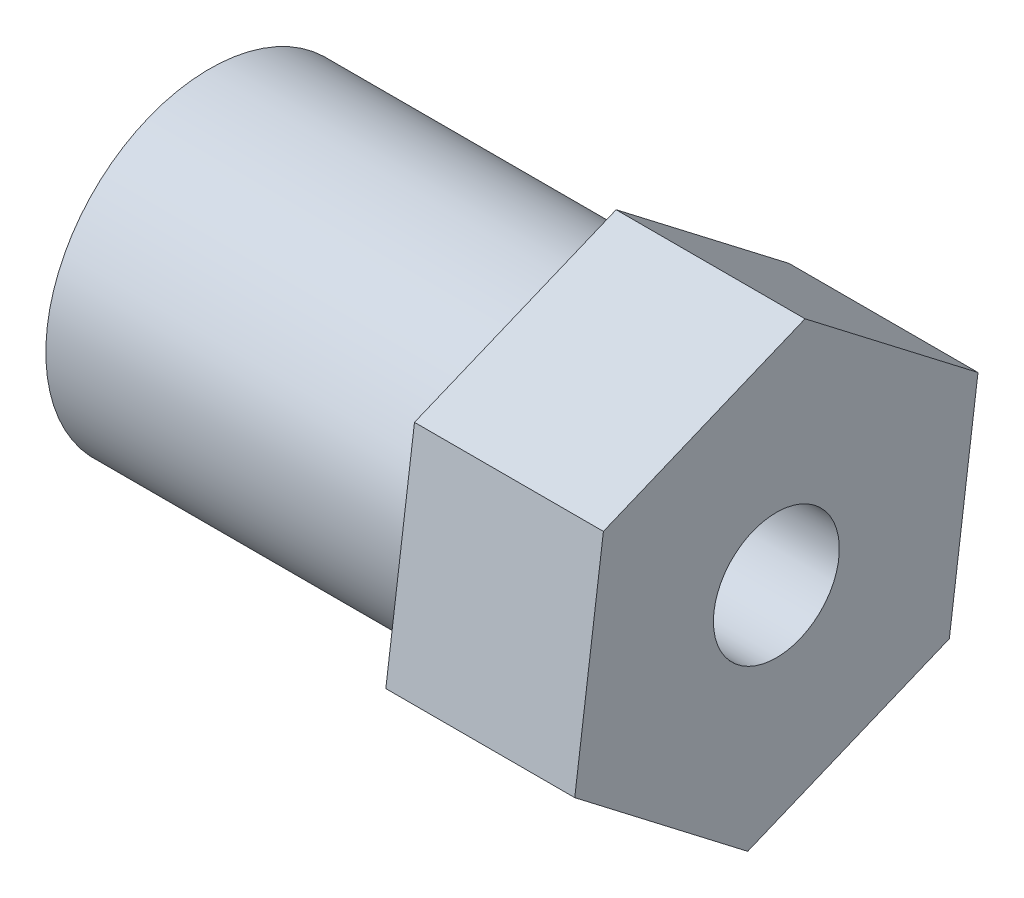
ISO-10303-21;
HEADER;
FILE_DESCRIPTION(('STEP AP214'),'2;1');
FILE_NAME('part.step','',(''),(''),'','','');
FILE_SCHEMA(('AUTOMOTIVE_DESIGN { 1 0 10303 214 1 1 1 1 }'));
ENDSEC;
DATA;
#1=APPLICATION_CONTEXT('core data for automotive mechanical design processes');
#2=APPLICATION_PROTOCOL_DEFINITION('international standard','automotive_design',2000,#1);
#3=PRODUCT_CONTEXT('',#1,'mechanical');
#4=PRODUCT('Part','Part','',(#3));
#5=PRODUCT_RELATED_PRODUCT_CATEGORY('part','',(#4));
#6=PRODUCT_DEFINITION_FORMATION('','',#4);
#7=PRODUCT_DEFINITION_CONTEXT('part definition',#1,'design');
#8=PRODUCT_DEFINITION('design','',#6,#7);
#9=PRODUCT_DEFINITION_SHAPE('','',#8);
#10=(LENGTH_UNIT() NAMED_UNIT(*) SI_UNIT(.MILLI.,.METRE.));
#11=(NAMED_UNIT(*) PLANE_ANGLE_UNIT() SI_UNIT($,.RADIAN.));
#12=(NAMED_UNIT(*) SI_UNIT($,.STERADIAN.) SOLID_ANGLE_UNIT());
#13=UNCERTAINTY_MEASURE_WITH_UNIT(LENGTH_MEASURE(1.E-05),#10,'distance_accuracy_value','');
#14=(GEOMETRIC_REPRESENTATION_CONTEXT(3) GLOBAL_UNCERTAINTY_ASSIGNED_CONTEXT((#13)) GLOBAL_UNIT_ASSIGNED_CONTEXT((#10,
#11,#12)) REPRESENTATION_CONTEXT('',''));
#15=CARTESIAN_POINT('',(0.,0.,0.));
#16=DIRECTION('',(0.,0.,1.));
#17=DIRECTION('',(1.,0.,0.));
#18=AXIS2_PLACEMENT_3D('',#15,#16,#17);
#19=CARTESIAN_POINT('',(82.,204.222582714816,-28.0072961834326));
#20=DIRECTION('',(0.,0.131421085967779,0.991326635455262));
#21=DIRECTION('',(0.,-0.991326635455262,0.131421085967779));
#22=AXIS2_PLACEMENT_3D('',#19,#20,#21);
#23=PLANE('',#22);
#24=DIRECTION('',(0.,-0.991326635455262,0.131421085967779));
#25=VECTOR('',#24,1.);
#26=CARTESIAN_POINT('',(88.,204.222582714816,-28.0072961834326));
#27=LINE('',#26,#25);
#28=CARTESIAN_POINT('',(88.,204.222582714816,-28.0072961834326));
#29=VERTEX_POINT('',#28);
#30=CARTESIAN_POINT('',(88.,197.354470316797,-27.0967841911043));
#31=VERTEX_POINT('',#30);
#32=EDGE_CURVE('E122',#29,#31,#27,.T.);
#33=ORIENTED_EDGE('',*,*,#32,.F.);
#34=DIRECTION('',(1.,0.,0.));
#35=VECTOR('',#34,1.);
#36=CARTESIAN_POINT('',(82.,204.222582714816,-28.0072961834326));
#37=LINE('',#36,#35);
#38=CARTESIAN_POINT('',(82.,204.222582714816,-28.0072961834326));
#39=VERTEX_POINT('',#38);
#40=EDGE_CURVE('E11',#39,#29,#37,.T.);
#41=ORIENTED_EDGE('',*,*,#40,.F.);
#42=DIRECTION('',(0.,-0.991326635455262,0.131421085967779));
#43=VECTOR('',#42,1.);
#44=CARTESIAN_POINT('',(82.,204.222582714816,-28.0072961834326));
#45=LINE('',#44,#43);
#46=CARTESIAN_POINT('',(82.,197.354470316797,-27.0967841911043));
#47=VERTEX_POINT('',#46);
#48=EDGE_CURVE('E137',#39,#47,#45,.T.);
#49=ORIENTED_EDGE('',*,*,#48,.T.);
#50=DIRECTION('',(1.,0.,0.));
#51=VECTOR('',#50,1.);
#52=CARTESIAN_POINT('',(82.,197.354470316797,-27.0967841911043));
#53=LINE('',#52,#51);
#54=EDGE_CURVE('E86',#47,#31,#53,.T.);
#55=ORIENTED_EDGE('',*,*,#54,.T.);
#56=EDGE_LOOP('',(#33,#41,#49,#55));
#57=FACE_BOUND('',#56,.T.);
#58=ADVANCED_FACE('F32',(#57),#23,.T.);
#59=CARTESIAN_POINT('',(82.,206.868112398019,-34.4105119923284));
#60=DIRECTION('',(0.,0.924224592736304,0.38184931868659));
#61=DIRECTION('',(0.,-0.38184931868659,0.924224592736304));
#62=AXIS2_PLACEMENT_3D('',#59,#60,#61);
#63=PLANE('',#62);
#64=DIRECTION('',(0.,-0.38184931868659,0.924224592736304));
#65=VECTOR('',#64,1.);
#66=CARTESIAN_POINT('',(88.,206.868112398019,-34.4105119923284));
#67=LINE('',#66,#65);
#68=CARTESIAN_POINT('',(88.,206.868112398019,-34.4105119923284));
#69=VERTEX_POINT('',#68);
#70=EDGE_CURVE('E135',#69,#29,#67,.T.);
#71=ORIENTED_EDGE('',*,*,#70,.F.);
#72=DIRECTION('',(1.,0.,0.));
#73=VECTOR('',#72,1.);
#74=CARTESIAN_POINT('',(82.,206.868112398019,-34.4105119923284));
#75=LINE('',#74,#73);
#76=CARTESIAN_POINT('',(82.,206.868112398019,-34.4105119923284));
#77=VERTEX_POINT('',#76);
#78=EDGE_CURVE('E45',#77,#69,#75,.T.);
#79=ORIENTED_EDGE('',*,*,#78,.F.);
#80=DIRECTION('',(0.,-0.38184931868659,0.924224592736304));
#81=VECTOR('',#80,1.);
#82=CARTESIAN_POINT('',(82.,206.868112398019,-34.4105119923284));
#83=LINE('',#82,#81);
#84=EDGE_CURVE('E112',#77,#39,#83,.T.);
#85=ORIENTED_EDGE('',*,*,#84,.T.);
#86=ORIENTED_EDGE('',*,*,#40,.T.);
#87=EDGE_LOOP('',(#71,#79,#85,#86));
#88=FACE_BOUND('',#87,.T.);
#89=ADVANCED_FACE('F146',(#88),#63,.T.);
#90=CARTESIAN_POINT('',(82.,202.645529683203,-39.9032158088957));
#91=DIRECTION('',(0.,0.792803506768531,-0.609477316768655));
#92=DIRECTION('',(0.,0.609477316768655,0.792803506768531));
#93=AXIS2_PLACEMENT_3D('',#90,#91,#92);
#94=PLANE('',#93);
#95=DIRECTION('',(0.,0.609477316768655,0.792803506768531));
#96=VECTOR('',#95,1.);
#97=CARTESIAN_POINT('',(88.,202.645529683203,-39.9032158088957));
#98=LINE('',#97,#96);
#99=CARTESIAN_POINT('',(88.,202.645529683203,-39.9032158088957));
#100=VERTEX_POINT('',#99);
#101=EDGE_CURVE('E99',#100,#69,#98,.T.);
#102=ORIENTED_EDGE('',*,*,#101,.F.);
#103=DIRECTION('',(1.,0.,0.));
#104=VECTOR('',#103,1.);
#105=CARTESIAN_POINT('',(82.,202.645529683203,-39.9032158088957));
#106=LINE('',#105,#104);
#107=CARTESIAN_POINT('',(82.,202.645529683203,-39.9032158088957));
#108=VERTEX_POINT('',#107);
#109=EDGE_CURVE('E94',#108,#100,#106,.T.);
#110=ORIENTED_EDGE('',*,*,#109,.F.);
#111=DIRECTION('',(0.,0.609477316768655,0.792803506768531));
#112=VECTOR('',#111,1.);
#113=CARTESIAN_POINT('',(82.,202.645529683203,-39.9032158088957));
#114=LINE('',#113,#112);
#115=EDGE_CURVE('E97',#108,#77,#114,.T.);
#116=ORIENTED_EDGE('',*,*,#115,.T.);
#117=ORIENTED_EDGE('',*,*,#78,.T.);
#118=EDGE_LOOP('',(#102,#110,#116,#117));
#119=FACE_BOUND('',#118,.T.);
#120=ADVANCED_FACE('F96',(#119),#94,.T.);
#121=CARTESIAN_POINT('',(82.,195.777417285184,-38.9927038165675));
#122=DIRECTION('',(0.,-0.131421085967778,-0.991326635455262));
#123=DIRECTION('',(0.,0.991326635455262,-0.131421085967778));
#124=AXIS2_PLACEMENT_3D('',#121,#122,#123);
#125=PLANE('',#124);
#126=DIRECTION('',(0.,0.991326635455262,-0.131421085967778));
#127=VECTOR('',#126,1.);
#128=CARTESIAN_POINT('',(88.,195.777417285184,-38.9927038165675));
#129=LINE('',#128,#127);
#130=CARTESIAN_POINT('',(88.,195.777417285184,-38.9927038165675));
#131=VERTEX_POINT('',#130);
#132=EDGE_CURVE('E132',#131,#100,#129,.T.);
#133=ORIENTED_EDGE('',*,*,#132,.F.);
#134=DIRECTION('',(1.,0.,0.));
#135=VECTOR('',#134,1.);
#136=CARTESIAN_POINT('',(82.,195.777417285184,-38.9927038165675));
#137=LINE('',#136,#135);
#138=CARTESIAN_POINT('',(82.,195.777417285184,-38.9927038165675));
#139=VERTEX_POINT('',#138);
#140=EDGE_CURVE('E104',#139,#131,#137,.T.);
#141=ORIENTED_EDGE('',*,*,#140,.F.);
#142=DIRECTION('',(0.,0.991326635455262,-0.131421085967778));
#143=VECTOR('',#142,1.);
#144=CARTESIAN_POINT('',(82.,195.777417285184,-38.9927038165675));
#145=LINE('',#144,#143);
#146=EDGE_CURVE('E110',#139,#108,#145,.T.);
#147=ORIENTED_EDGE('',*,*,#146,.T.);
#148=ORIENTED_EDGE('',*,*,#109,.T.);
#149=EDGE_LOOP('',(#133,#141,#147,#148));
#150=FACE_BOUND('',#149,.T.);
#151=ADVANCED_FACE('F114',(#150),#125,.T.);
#152=CARTESIAN_POINT('',(82.,193.131887601981,-32.5894880076718));
#153=DIRECTION('',(0.,-0.924224592736302,-0.381849318686595));
#154=DIRECTION('',(0.,0.381849318686595,-0.924224592736302));
#155=AXIS2_PLACEMENT_3D('',#152,#153,#154);
#156=PLANE('',#155);
#157=DIRECTION('',(0.,0.381849318686595,-0.924224592736302));
#158=VECTOR('',#157,1.);
#159=CARTESIAN_POINT('',(88.,193.131887601981,-32.5894880076718));
#160=LINE('',#159,#158);
#161=CARTESIAN_POINT('',(88.,193.131887601981,-32.5894880076718));
#162=VERTEX_POINT('',#161);
#163=EDGE_CURVE('E129',#162,#131,#160,.T.);
#164=ORIENTED_EDGE('',*,*,#163,.F.);
#165=DIRECTION('',(1.,0.,0.));
#166=VECTOR('',#165,1.);
#167=CARTESIAN_POINT('',(82.,193.131887601981,-32.5894880076718));
#168=LINE('',#167,#166);
#169=CARTESIAN_POINT('',(82.,193.131887601981,-32.5894880076718));
#170=VERTEX_POINT('',#169);
#171=EDGE_CURVE('E141',#170,#162,#168,.T.);
#172=ORIENTED_EDGE('',*,*,#171,.F.);
#173=DIRECTION('',(0.,0.381849318686595,-0.924224592736302));
#174=VECTOR('',#173,1.);
#175=CARTESIAN_POINT('',(82.,193.131887601981,-32.5894880076718));
#176=LINE('',#175,#174);
#177=EDGE_CURVE('E115',#170,#139,#176,.T.);
#178=ORIENTED_EDGE('',*,*,#177,.T.);
#179=ORIENTED_EDGE('',*,*,#140,.T.);
#180=EDGE_LOOP('',(#164,#172,#178,#179));
#181=FACE_BOUND('',#180,.T.);
#182=ADVANCED_FACE('F159',(#181),#156,.T.);
#183=CARTESIAN_POINT('',(82.,197.354470316797,-27.0967841911043));
#184=DIRECTION('',(0.,-0.792803506768541,0.609477316768642));
#185=DIRECTION('',(0.,-0.609477316768642,-0.792803506768541));
#186=AXIS2_PLACEMENT_3D('',#183,#184,#185);
#187=PLANE('',#186);
#188=DIRECTION('',(0.,-0.609477316768642,-0.792803506768541));
#189=VECTOR('',#188,1.);
#190=CARTESIAN_POINT('',(88.,197.354470316797,-27.0967841911043));
#191=LINE('',#190,#189);
#192=EDGE_CURVE('E125',#31,#162,#191,.T.);
#193=ORIENTED_EDGE('',*,*,#192,.F.);
#194=ORIENTED_EDGE('',*,*,#54,.F.);
#195=DIRECTION('',(0.,-0.609477316768642,-0.792803506768541));
#196=VECTOR('',#195,1.);
#197=CARTESIAN_POINT('',(82.,197.354470316797,-27.0967841911043));
#198=LINE('',#197,#196);
#199=EDGE_CURVE('E117',#47,#170,#198,.T.);
#200=ORIENTED_EDGE('',*,*,#199,.T.);
#201=ORIENTED_EDGE('',*,*,#171,.T.);
#202=EDGE_LOOP('',(#193,#194,#200,#201));
#203=FACE_BOUND('',#202,.T.);
#204=ADVANCED_FACE('F142',(#203),#187,.T.);
#205=CARTESIAN_POINT('',(82.,0.,0.));
#206=DIRECTION('',(1.,0.,0.));
#207=DIRECTION('',(0.,0.,-1.));
#208=AXIS2_PLACEMENT_3D('',#205,#206,#207);
#209=PLANE('',#208);
#210=CARTESIAN_POINT('',(82.,200.,-33.5000000000001));
#211=DIRECTION('',(1.,0.,0.));
#212=DIRECTION('',(0.,0.,-1.));
#213=AXIS2_PLACEMENT_3D('',#210,#211,#212);
#214=CIRCLE('',#213,5.20000000000001);
#215=CARTESIAN_POINT('',(82.,200.,-38.7000000000001));
#216=VERTEX_POINT('',#215);
#217=EDGE_CURVE('E217',#216,#216,#214,.T.);
#218=ORIENTED_EDGE('',*,*,#217,.T.);
#219=EDGE_LOOP('',(#218));
#220=FACE_BOUND('',#219,.T.);
#221=ORIENTED_EDGE('',*,*,#48,.F.);
#222=ORIENTED_EDGE('',*,*,#84,.F.);
#223=ORIENTED_EDGE('',*,*,#115,.F.);
#224=ORIENTED_EDGE('',*,*,#146,.F.);
#225=ORIENTED_EDGE('',*,*,#177,.F.);
#226=ORIENTED_EDGE('',*,*,#199,.F.);
#227=EDGE_LOOP('',(#221,#222,#223,#224,#225,#226));
#228=FACE_BOUND('',#227,.T.);
#229=ADVANCED_FACE('F108',(#220,#228),#209,.F.);
#230=CARTESIAN_POINT('',(88.,0.,0.));
#231=DIRECTION('',(1.,0.,0.));
#232=DIRECTION('',(0.,0.,-1.));
#233=AXIS2_PLACEMENT_3D('',#230,#231,#232);
#234=PLANE('',#233);
#235=CARTESIAN_POINT('',(88.,200.,-33.5000000000001));
#236=DIRECTION('',(-1.,0.,0.));
#237=DIRECTION('',(0.,0.,1.));
#238=AXIS2_PLACEMENT_3D('',#235,#236,#237);
#239=CIRCLE('',#238,2.);
#240=CARTESIAN_POINT('',(88.,200.,-31.5000000000001));
#241=VERTEX_POINT('',#240);
#242=EDGE_CURVE('E211',#241,#241,#239,.T.);
#243=ORIENTED_EDGE('',*,*,#242,.T.);
#244=EDGE_LOOP('',(#243));
#245=FACE_BOUND('',#244,.T.);
#246=ORIENTED_EDGE('',*,*,#32,.T.);
#247=ORIENTED_EDGE('',*,*,#192,.T.);
#248=ORIENTED_EDGE('',*,*,#163,.T.);
#249=ORIENTED_EDGE('',*,*,#132,.T.);
#250=ORIENTED_EDGE('',*,*,#101,.T.);
#251=ORIENTED_EDGE('',*,*,#70,.T.);
#252=EDGE_LOOP('',(#246,#247,#248,#249,#250,#251));
#253=FACE_BOUND('',#252,.T.);
#254=ADVANCED_FACE('F145',(#245,#253),#234,.T.);
#255=CARTESIAN_POINT('',(70.,200.,-33.5000000000001));
#256=DIRECTION('',(1.,0.,0.));
#257=DIRECTION('',(0.,0.,-1.));
#258=AXIS2_PLACEMENT_3D('',#255,#256,#257);
#259=CYLINDRICAL_SURFACE('',#258,5.20000000000001);
#260=CARTESIAN_POINT('',(74.,194.843394423274,-34.1703871464174));
#261=CARTESIAN_POINT('',(73.9172151989861,194.843393978066,-34.1703888603776));
#262=CARTESIAN_POINT('',(73.8344160251718,194.844298121491,-34.1774531707076));
#263=CARTESIAN_POINT('',(73.6712142410844,194.848048736445,-34.20540137638));
#264=CARTESIAN_POINT('',(73.5908125545988,194.850895946824,-34.2262905285315));
#265=CARTESIAN_POINT('',(73.4347772141554,194.858906041283,-34.2809668792829));
#266=CARTESIAN_POINT('',(73.3591373856836,194.864065853102,-34.3147369569112));
#267=CARTESIAN_POINT('',(73.2144743297482,194.877249095533,-34.3938826663532));
#268=CARTESIAN_POINT('',(73.1454517915219,194.885272824032,-34.439259505291));
#269=CARTESIAN_POINT('',(73.0143270754073,194.905028170433,-34.5411564021015));
#270=CARTESIAN_POINT('',(72.9524080380351,194.916836629289,-34.5978973318329));
#271=CARTESIAN_POINT('',(72.8388832656474,194.944753001841,-34.7199972284268));
#272=CARTESIAN_POINT('',(72.7872782954408,194.960861234168,-34.7853568337855));
#273=CARTESIAN_POINT('',(72.6952844079851,194.998099401605,-34.9234305306471));
#274=CARTESIAN_POINT('',(72.6550333594924,195.019285727295,-34.9962215239997));
#275=CARTESIAN_POINT('',(72.587832584414,195.066805126155,-35.1461351458379));
#276=CARTESIAN_POINT('',(72.5608800437391,195.093137108808,-35.2232568540532));
#277=CARTESIAN_POINT('',(72.5217298919954,195.149961624158,-35.3771435349726));
#278=CARTESIAN_POINT('',(72.5091471215833,195.180319920435,-35.4538600585044));
#279=CARTESIAN_POINT('',(72.4978217852048,195.245092207103,-35.6065915264637));
#280=CARTESIAN_POINT('',(72.49907709674,195.279505574722,-35.6826065766938));
#281=CARTESIAN_POINT('',(72.5151258775454,195.350487593366,-35.8299287915649));
#282=CARTESIAN_POINT('',(72.5296011001577,195.386986755001,-35.9013045625287));
#283=CARTESIAN_POINT('',(72.5711073844156,195.461556151297,-36.0394274746923));
#284=CARTESIAN_POINT('',(72.5981396509638,195.499626536405,-36.1061741710058));
#285=CARTESIAN_POINT('',(72.6645058214607,195.576544793148,-36.2347324814715));
#286=CARTESIAN_POINT('',(72.7040557345057,195.615394146555,-36.2964314686664));
#287=CARTESIAN_POINT('',(72.7941667895674,195.691497847416,-36.4123226160529));
#288=CARTESIAN_POINT('',(72.8447306993233,195.728751791135,-36.4665128837461));
#289=CARTESIAN_POINT('',(72.9577458242448,195.801303431706,-36.5683890530553));
#290=CARTESIAN_POINT('',(73.0205799479713,195.836470475263,-36.6157439516502));
#291=CARTESIAN_POINT('',(73.1551824754775,195.901278621654,-36.7005215601845));
#292=CARTESIAN_POINT('',(73.2269514704255,195.93091935852,-36.737943612412));
#293=CARTESIAN_POINT('',(73.3778628215966,195.982929515278,-36.8022521066046));
#294=CARTESIAN_POINT('',(73.4570306783118,196.005272498135,-36.8291003141734));
#295=CARTESIAN_POINT('',(73.6202755873242,196.040945476245,-36.8714482836556));
#296=CARTESIAN_POINT('',(73.7043507688421,196.054278882079,-36.8869523400885));
#297=CARTESIAN_POINT('',(73.8710860218403,196.070535307674,-36.905797376701));
#298=CARTESIAN_POINT('',(73.9536478267788,196.073887095533,-36.9096394534047));
#299=CARTESIAN_POINT('',(74.118399008938,196.071150488445,-36.9064859447009));
#300=CARTESIAN_POINT('',(74.2005884385341,196.065063465213,-36.8994919340727));
#301=CARTESIAN_POINT('',(74.3599370560577,196.04420141504,-36.8751888603725));
#302=CARTESIAN_POINT('',(74.4371723147333,196.029668109034,-36.8581666129784));
#303=CARTESIAN_POINT('',(74.5869661730415,195.993078214786,-36.8144208755424));
#304=CARTESIAN_POINT('',(74.659524016439,195.971020413608,-36.7876958213797));
#305=CARTESIAN_POINT('',(74.8003140667745,195.919945440837,-36.7241062575734));
#306=CARTESIAN_POINT('',(74.8683504099315,195.890738826024,-36.6869608380765));
#307=CARTESIAN_POINT('',(74.9960282912814,195.827389103074,-36.6035554363839));
#308=CARTESIAN_POINT('',(75.0556676244413,195.79324470304,-36.5572930677257));
#309=CARTESIAN_POINT('',(75.1675168772009,195.720192970084,-36.4542180850339));
#310=CARTESIAN_POINT('',(75.2192947707026,195.681143632664,-36.3970361547505));
#311=CARTESIAN_POINT('',(75.310757616177,195.60150303473,-36.2746259363155));
#312=CARTESIAN_POINT('',(75.3504426624268,195.560911786241,-36.2093977108994));
#313=CARTESIAN_POINT('',(75.4163804491606,195.480193745446,-36.0724779022995));
#314=CARTESIAN_POINT('',(75.4426704486871,195.440065971621,-36.0008049070845));
#315=CARTESIAN_POINT('',(75.4810146488863,195.361904144143,-35.8526728414292));
#316=CARTESIAN_POINT('',(75.4930729057416,195.323869496877,-35.7762151412207));
#317=CARTESIAN_POINT('',(75.5022677328863,195.252743589415,-35.6237609582594));
#318=CARTESIAN_POINT('',(75.4999615192239,195.21951829871,-35.547860282601));
#319=CARTESIAN_POINT('',(75.4817542948019,195.157271264159,-35.3959729901264));
#320=CARTESIAN_POINT('',(75.4658545064532,195.128249142616,-35.3199863816514));
#321=CARTESIAN_POINT('',(75.4213463160934,195.075350427721,-35.1715090116961));
#322=CARTESIAN_POINT('',(75.3929514849842,195.051396976855,-35.0989812897863));
#323=CARTESIAN_POINT('',(75.3243715610934,195.008114373842,-34.9582536400124));
#324=CARTESIAN_POINT('',(75.2841849777102,194.988785806889,-34.8900542606229));
#325=CARTESIAN_POINT('',(75.1920095253379,194.954084483143,-34.7583688591094));
#326=CARTESIAN_POINT('',(75.1397532262464,194.938821442735,-34.6950412197738));
#327=CARTESIAN_POINT('',(75.0254135175609,194.912386360501,-34.5769660317682));
#328=CARTESIAN_POINT('',(74.9633275352998,194.901215392214,-34.5222207367925));
#329=CARTESIAN_POINT('',(74.8290833076645,194.882080611344,-34.4217344289372));
#330=CARTESIAN_POINT('',(74.7566962389085,194.874212749805,-34.3762802542842));
#331=CARTESIAN_POINT('',(74.605157087981,194.861446262608,-34.2980267974329));
#332=CARTESIAN_POINT('',(74.5260082535178,194.856546220539,-34.2652214812085));
#333=CARTESIAN_POINT('',(74.3728706788545,194.849572842622,-34.216677673642));
#334=CARTESIAN_POINT('',(74.2993870394306,194.847232721758,-34.1993739212099));
#335=CARTESIAN_POINT('',(74.1506060667912,194.844143822289,-34.1762286537719));
#336=CARTESIAN_POINT('',(74.0753089804747,194.843394828279,-34.1703855872352));
#337=CARTESIAN_POINT('',(74.,194.843394423274,-34.1703871464174));
#338=B_SPLINE_CURVE_WITH_KNOTS('',3,(#260,#261,#262,#263,#264,#265,#266,#267,#268,#269,#270,
#271,#272,#273,#274,#275,#276,#277,#278,#279,#280,#281,#282,#283,#284,#285,#286,#287,#288,#289,
#290,#291,#292,#293,#294,#295,#296,#297,#298,#299,#300,#301,#302,#303,#304,#305,#306,#307,#308,
#309,#310,#311,#312,#313,#314,#315,#316,#317,#318,#319,#320,#321,#322,#323,#324,#325,#326,#327,
#328,#329,#330,#331,#332,#333,#334,#335,#336,#337),.UNSPECIFIED.,.T.,.F.,(4,2,2,2,2,2,2,2,2,2,2,
2,2,2,2,2,2,2,2,2,2,2,2,2,2,2,2,2,2,2,2,2,2,2,2,2,2,2,4),(0.,0.248078580290188,
0.496251545139838,0.744095788357517,0.991965818312516,1.24522628959864,1.49850553369757,
1.7547395146081,2.01091925072391,2.26005825866556,2.50915905395316,2.75241684979214,
2.99569799209189,3.24342993126932,3.49122419569248,3.74856460522973,4.00592205053566,
4.26420172392208,4.52238357052391,4.76930250341406,5.01618555560962,5.2563286501694,
5.49651047370173,5.74391967006568,5.99139371475406,6.24955419513769,6.50771266282331,
6.76514907401896,7.02251209564666,7.26995552317413,7.51737670153151,7.7607238432678,
8.00410175990412,8.25350180005201,8.50296722249372,8.75924763090075,9.01540563129902,
9.24111221587513,9.46678824251845),.UNSPECIFIED.);
#339=CARTESIAN_POINT('',(74.,194.843394423274,-34.1703871464174));
#340=VERTEX_POINT('',#339);
#341=EDGE_CURVE('E181',#340,#340,#338,.T.);
#342=ORIENTED_EDGE('',*,*,#341,.F.);
#343=EDGE_LOOP('',(#342));
#344=FACE_BOUND('',#343,.T.);
#345=CARTESIAN_POINT('',(70.,200.,-33.5000000000001));
#346=DIRECTION('',(1.,0.,0.));
#347=DIRECTION('',(0.,0.,-1.));
#348=AXIS2_PLACEMENT_3D('',#345,#346,#347);
#349=CIRCLE('',#348,5.20000000000001);
#350=CARTESIAN_POINT('',(70.,200.,-38.7000000000001));
#351=VERTEX_POINT('',#350);
#352=EDGE_CURVE('E126',#351,#351,#349,.T.);
#353=ORIENTED_EDGE('',*,*,#352,.T.);
#354=EDGE_LOOP('',(#353));
#355=FACE_BOUND('',#354,.T.);
#356=ORIENTED_EDGE('',*,*,#217,.F.);
#357=EDGE_LOOP('',(#356));
#358=FACE_BOUND('',#357,.T.);
#359=ADVANCED_FACE('F170',(#344,#355,#358),#259,.T.);
#360=CARTESIAN_POINT('',(70.,205.2,-33.5000000000001));
#361=DIRECTION('',(-1.,0.,0.));
#362=DIRECTION('',(0.,0.,1.));
#363=AXIS2_PLACEMENT_3D('',#360,#361,#362);
#364=PLANE('',#363);
#365=CARTESIAN_POINT('',(70.,200.,-33.5000000000001));
#366=DIRECTION('',(-1.,0.,0.));
#367=DIRECTION('',(0.,0.,1.));
#368=AXIS2_PLACEMENT_3D('',#365,#366,#367);
#369=CIRCLE('',#368,2.5);
#370=CARTESIAN_POINT('',(70.,200.,-31.0000000000001));
#371=VERTEX_POINT('',#370);
#372=EDGE_CURVE('E186',#371,#371,#369,.T.);
#373=ORIENTED_EDGE('',*,*,#372,.F.);
#374=EDGE_LOOP('',(#373));
#375=FACE_BOUND('',#374,.T.);
#376=ORIENTED_EDGE('',*,*,#352,.F.);
#377=EDGE_LOOP('',(#376));
#378=FACE_BOUND('',#377,.T.);
#379=ADVANCED_FACE('F177',(#375,#378),#364,.T.);
#380=CARTESIAN_POINT('',(70.,200.,-33.5000000000001));
#381=DIRECTION('',(-1.,0.,0.));
#382=DIRECTION('',(0.,0.,1.));
#383=AXIS2_PLACEMENT_3D('',#380,#381,#382);
#384=CYLINDRICAL_SURFACE('',#383,2.);
#385=ORIENTED_EDGE('',*,*,#242,.F.);
#386=EDGE_LOOP('',(#385));
#387=FACE_BOUND('',#386,.T.);
#388=CARTESIAN_POINT('',(82.,200.,-33.5000000000001));
#389=DIRECTION('',(-1.,0.,0.));
#390=DIRECTION('',(0.,0.,1.));
#391=AXIS2_PLACEMENT_3D('',#388,#389,#390);
#392=CIRCLE('',#391,2.);
#393=CARTESIAN_POINT('',(82.,200.,-31.5000000000001));
#394=VERTEX_POINT('',#393);
#395=EDGE_CURVE('E214',#394,#394,#392,.T.);
#396=ORIENTED_EDGE('',*,*,#395,.T.);
#397=EDGE_LOOP('',(#396));
#398=FACE_BOUND('',#397,.T.);
#399=ADVANCED_FACE('F200',(#387,#398),#384,.F.);
#400=CARTESIAN_POINT('',(82.,202.,-33.5000000000001));
#401=DIRECTION('',(1.,0.,0.));
#402=DIRECTION('',(0.,0.,-1.));
#403=AXIS2_PLACEMENT_3D('',#400,#401,#402);
#404=PLANE('',#403);
#405=ORIENTED_EDGE('',*,*,#395,.F.);
#406=EDGE_LOOP('',(#405));
#407=FACE_BOUND('',#406,.T.);
#408=CARTESIAN_POINT('',(82.,200.,-33.5000000000001));
#409=DIRECTION('',(-1.,0.,0.));
#410=DIRECTION('',(0.,0.,1.));
#411=AXIS2_PLACEMENT_3D('',#408,#409,#410);
#412=CIRCLE('',#411,2.5);
#413=CARTESIAN_POINT('',(82.,200.,-31.0000000000001));
#414=VERTEX_POINT('',#413);
#415=EDGE_CURVE('E215',#414,#414,#412,.T.);
#416=ORIENTED_EDGE('',*,*,#415,.T.);
#417=EDGE_LOOP('',(#416));
#418=FACE_BOUND('',#417,.T.);
#419=ADVANCED_FACE('F197',(#407,#418),#404,.F.);
#420=CARTESIAN_POINT('',(70.,200.,-33.5000000000001));
#421=DIRECTION('',(-1.,0.,0.));
#422=DIRECTION('',(0.,0.,1.));
#423=AXIS2_PLACEMENT_3D('',#420,#421,#422);
#424=CYLINDRICAL_SURFACE('',#423,2.5);
#425=CARTESIAN_POINT('',(74.,197.539670324401,-33.0564034633086));
#426=CARTESIAN_POINT('',(73.9225266267053,197.539669499219,-33.0564045583349));
#427=CARTESIAN_POINT('',(73.845047976135,197.538363926234,-33.0634743562622));
#428=CARTESIAN_POINT('',(73.6925964499588,197.533619593549,-33.091153800752));
#429=CARTESIAN_POINT('',(73.6176259323304,197.530178882813,-33.1117758320247));
#430=CARTESIAN_POINT('',(73.4726417339645,197.522413848592,-33.1649251663414));
#431=CARTESIAN_POINT('',(73.4026018604466,197.518094757931,-33.1973828286638));
#432=CARTESIAN_POINT('',(73.2682363682398,197.51008325487,-33.2725359159389));
#433=CARTESIAN_POINT('',(73.2039127845073,197.50639106522,-33.3152349668991));
#434=CARTESIAN_POINT('',(73.0757946910068,197.500943292853,-33.4140049433499));
#435=CARTESIAN_POINT('',(73.0126893126766,197.499416889788,-33.4709835179917));
#436=CARTESIAN_POINT('',(72.8955496296637,197.501000343828,-33.5936088268271));
#437=CARTESIAN_POINT('',(72.8415200659519,197.504112615728,-33.6592600596038));
#438=CARTESIAN_POINT('',(72.7406024268421,197.517203083311,-33.8019586405192));
#439=CARTESIAN_POINT('',(72.6944223524526,197.527621465119,-33.8794724054334));
#440=CARTESIAN_POINT('',(72.6157385294383,197.557559612361,-34.0395243359141));
#441=CARTESIAN_POINT('',(72.5832208242325,197.577070046754,-34.1220572750449));
#442=CARTESIAN_POINT('',(72.536071595204,197.623606702144,-34.2802884660804));
#443=CARTESIAN_POINT('',(72.5199567554848,197.649666143276,-34.3558276303137));
#444=CARTESIAN_POINT('',(72.5008747445323,197.709664326384,-34.5054048459593));
#445=CARTESIAN_POINT('',(72.4978992142492,197.743598044384,-34.5794438219148));
#446=CARTESIAN_POINT('',(72.5046725622689,197.814525816016,-34.7161601531494));
#447=CARTESIAN_POINT('',(72.5131885125231,197.850882396946,-34.7792360045947));
#448=CARTESIAN_POINT('',(72.5402371946902,197.927826946122,-34.9004477809186));
#449=CARTESIAN_POINT('',(72.5587715649116,197.968415605562,-34.9585828960406));
#450=CARTESIAN_POINT('',(72.6057504722091,198.053792759359,-35.0708031344303));
#451=CARTESIAN_POINT('',(72.6345149470184,198.098677853171,-35.1246792465771));
#452=CARTESIAN_POINT('',(72.7006993430764,198.189725751855,-35.2255524178307));
#453=CARTESIAN_POINT('',(72.7381215150272,198.235888886221,-35.2725476829585));
#454=CARTESIAN_POINT('',(72.8263879986837,198.33426274464,-35.3656134156886));
#455=CARTESIAN_POINT('',(72.8783738490789,198.386424632211,-35.4106524321732));
#456=CARTESIAN_POINT('',(72.9913374244609,198.487963903157,-35.4919816789674));
#457=CARTESIAN_POINT('',(73.0523313563756,198.537336041251,-35.5282558232105));
#458=CARTESIAN_POINT('',(73.1905255302953,198.636215296197,-35.5962117704441));
#459=CARTESIAN_POINT('',(73.2687953749673,198.685001602638,-35.6267906698331));
#460=CARTESIAN_POINT('',(73.4346910029135,198.770598756742,-35.6773968695663));
#461=CARTESIAN_POINT('',(73.5222888860091,198.807444053686,-35.6974546283837));
#462=CARTESIAN_POINT('',(73.6755523794834,198.854516250062,-35.7222364393701));
#463=CARTESIAN_POINT('',(73.7393013922727,198.869484907278,-35.7298107674736));
#464=CARTESIAN_POINT('',(73.8686859071902,198.88964513247,-35.73992096969));
#465=CARTESIAN_POINT('',(73.9343186516777,198.894850319461,-35.7424638623992));
#466=CARTESIAN_POINT('',(74.0656742112672,198.894855962768,-35.7424666477883));
#467=CARTESIAN_POINT('',(74.1313970253679,198.889642015512,-35.7399195039229));
#468=CARTESIAN_POINT('',(74.2609519531718,198.8694355603,-35.7297859306896));
#469=CARTESIAN_POINT('',(74.3247815791751,198.854430734526,-35.7221931532324));
#470=CARTESIAN_POINT('',(74.4633342856021,198.811838551999,-35.6997660419839));
#471=CARTESIAN_POINT('',(74.5372020608737,198.782155849689,-35.6836710280045));
#472=CARTESIAN_POINT('',(74.678527885452,198.713831096657,-35.644136571698));
#473=CARTESIAN_POINT('',(74.745977355288,198.675177284861,-35.6206874739082));
#474=CARTESIAN_POINT('',(74.8748588038665,198.591251085605,-35.5659086141472));
#475=CARTESIAN_POINT('',(74.936173850682,198.545880482319,-35.5344558264155));
#476=CARTESIAN_POINT('',(75.0509631871663,198.451553422883,-35.4636183160421));
#477=CARTESIAN_POINT('',(75.1044354832643,198.40259605973,-35.4242315826662));
#478=CARTESIAN_POINT('',(75.2113934119063,198.294559348264,-35.3296129488043));
#479=CARTESIAN_POINT('',(75.2632433830482,198.235208124135,-35.2728143180654));
#480=CARTESIAN_POINT('',(75.3531485629706,198.11797864532,-35.1478220671402));
#481=CARTESIAN_POINT('',(75.3912106597055,198.060099668623,-35.0796341615946));
#482=CARTESIAN_POINT('',(75.4487494939435,197.953948257045,-34.9390155349254));
#483=CARTESIAN_POINT('',(75.4695181695243,197.905277260485,-34.8674214869793));
#484=CARTESIAN_POINT('',(75.49598349719,197.814744667578,-34.717493945423));
#485=CARTESIAN_POINT('',(75.5017006294579,197.772873891287,-34.6391697594131));
#486=CARTESIAN_POINT('',(75.497730579512,197.703491210475,-34.4908284570511));
#487=CARTESIAN_POINT('',(75.4902078369097,197.674769942874,-34.421308214943));
#488=CARTESIAN_POINT('',(75.4640223003108,197.62425006043,-34.2818614981267));
#489=CARTESIAN_POINT('',(75.4453597876759,197.602451270765,-34.2119350337228));
#490=CARTESIAN_POINT('',(75.3982662499363,197.566178401412,-34.0756454644394));
#491=CARTESIAN_POINT('',(75.3700952446858,197.551532419415,-34.0092369641435));
#492=CARTESIAN_POINT('',(75.3048560888365,197.528152662639,-33.8798643298055));
#493=CARTESIAN_POINT('',(75.2677859700562,197.519420197365,-33.8169009614976));
#494=CARTESIAN_POINT('',(75.1816125854926,197.506317235145,-33.6898029398656));
#495=CARTESIAN_POINT('',(75.1316771800852,197.502469633608,-33.6261796215964));
#496=CARTESIAN_POINT('',(75.0233172989256,197.499289059001,-33.5064244987795));
#497=CARTESIAN_POINT('',(74.9648839708615,197.49996082721,-33.4503006248655));
#498=CARTESIAN_POINT('',(74.8335764696594,197.504375742343,-33.3414221166377));
#499=CARTESIAN_POINT('',(74.7598187836769,197.508452617975,-33.2897388420235));
#500=CARTESIAN_POINT('',(74.6044407022078,197.517639916904,-33.200119507318));
#501=CARTESIAN_POINT('',(74.5228288451988,197.522749224319,-33.1621687272886));
#502=CARTESIAN_POINT('',(74.3680412330269,197.530851703839,-33.1076528592689));
#503=CARTESIAN_POINT('',(74.2957708771478,197.534056579626,-33.0885574192116));
#504=CARTESIAN_POINT('',(74.1490004682434,197.538465305799,-33.062938357767));
#505=CARTESIAN_POINT('',(74.0745026742832,197.539671117941,-33.0564024102708));
#506=CARTESIAN_POINT('',(74.,197.539670324401,-33.0564034633086));
#507=B_SPLINE_CURVE_WITH_KNOTS('',3,(#425,#426,#427,#428,#429,#430,#431,#432,#433,#434,#435,
#436,#437,#438,#439,#440,#441,#442,#443,#444,#445,#446,#447,#448,#449,#450,#451,#452,#453,#454,
#455,#456,#457,#458,#459,#460,#461,#462,#463,#464,#465,#466,#467,#468,#469,#470,#471,#472,#473,
#474,#475,#476,#477,#478,#479,#480,#481,#482,#483,#484,#485,#486,#487,#488,#489,#490,#491,#492,
#493,#494,#495,#496,#497,#498,#499,#500,#501,#502,#503,#504,#505,#506),.UNSPECIFIED.,.T.,.F.,(4,
2,2,2,2,2,2,2,2,2,2,2,2,2,2,2,2,2,2,2,2,2,2,2,2,2,2,2,2,2,2,2,2,2,2,2,2,2,2,2,4),(0.,
0.232115412567916,0.464443239353907,0.695425546287287,0.926489754528686,1.18053911328809,
1.43472077092547,1.70570173845447,1.97640521256053,2.21956329233244,2.46256665593466,
2.68146513046779,2.90039941222287,3.12688940013624,3.35343833391646,3.61139501945372,
3.86982159391031,4.15982873124356,4.44899160492324,4.64592051209144,4.84257451924342,
5.03950057200845,5.23667485463971,5.47903016657014,5.72170501781811,5.96836279896002,
6.21508317047665,6.50498496551286,6.79474173506548,7.06017476157055,7.32524643421509,
7.55089743252318,7.77654273171306,7.99645960226579,8.21642515584135,8.45836471645899,
8.70055813591424,8.96972475150665,9.23860198517532,9.4620363793396,9.68525137880618),.UNSPECIFIED.);
#508=CARTESIAN_POINT('',(74.,197.539670324401,-33.0564034633086));
#509=VERTEX_POINT('',#508);
#510=EDGE_CURVE('E35',#509,#509,#507,.T.);
#511=ORIENTED_EDGE('',*,*,#510,.T.);
#512=EDGE_LOOP('',(#511));
#513=FACE_BOUND('',#512,.T.);
#514=ORIENTED_EDGE('',*,*,#415,.F.);
#515=EDGE_LOOP('',(#514));
#516=FACE_BOUND('',#515,.T.);
#517=ORIENTED_EDGE('',*,*,#372,.T.);
#518=EDGE_LOOP('',(#517));
#519=FACE_BOUND('',#518,.T.);
#520=ADVANCED_FACE('F191',(#513,#516,#519),#424,.F.);
#521=CARTESIAN_POINT('',(74.,198.322079162089,-34.356128365497));
#522=DIRECTION('',(0.,0.924224592736303,0.381849318686592));
#523=DIRECTION('',(0.,-0.381849318686592,0.924224592736303));
#524=AXIS2_PLACEMENT_3D('',#521,#522,#523);
#525=CYLINDRICAL_SURFACE('',#524,1.49999999999999);
#526=ORIENTED_EDGE('',*,*,#341,.T.);
#527=EDGE_LOOP('',(#526));
#528=FACE_BOUND('',#527,.T.);
#529=ORIENTED_EDGE('',*,*,#510,.F.);
#530=EDGE_LOOP('',(#529));
#531=FACE_BOUND('',#530,.T.);
#532=ADVANCED_FACE('F188',(#528,#531),#525,.F.);
#533=CLOSED_SHELL('',(#58,#89,#120,#151,#182,#204,#229,#254,#359,#379,#399,#419,#520,#532));
#534=MANIFOLD_SOLID_BREP('B2',#533);
#535=ADVANCED_BREP_SHAPE_REPRESENTATION('',(#18,#534),#14);
#536=SHAPE_DEFINITION_REPRESENTATION(#9,#535);
ENDSEC;
END-ISO-10303-21;
